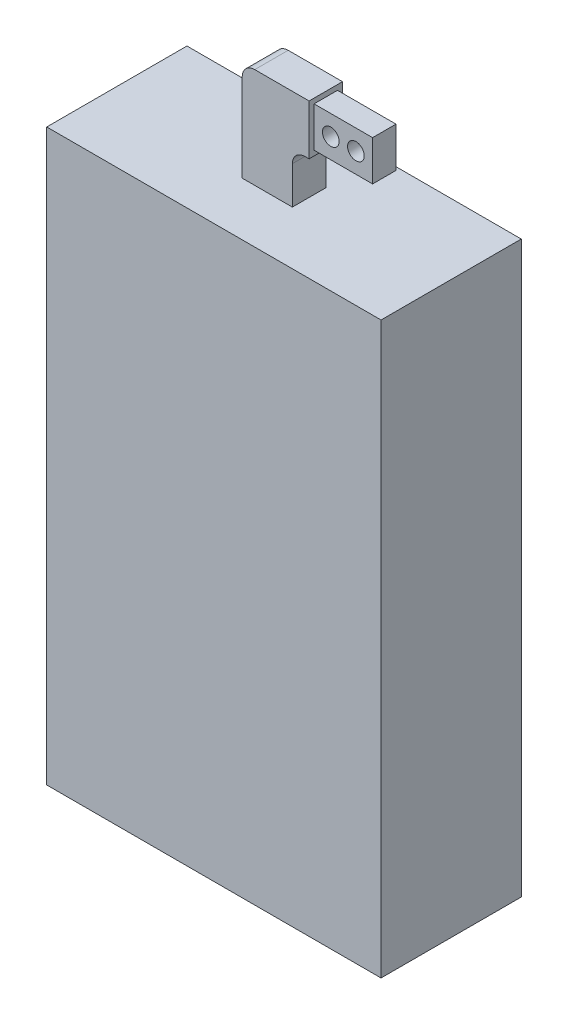
ISO-10303-21;
HEADER;
FILE_DESCRIPTION(('STEP AP214'),'2;1');
FILE_NAME('part.step','',(''),(''),'','','');
FILE_SCHEMA(('AUTOMOTIVE_DESIGN { 1 0 10303 214 1 1 1 1 }'));
ENDSEC;
DATA;
#1=APPLICATION_CONTEXT('core data for automotive mechanical design processes');
#2=APPLICATION_PROTOCOL_DEFINITION('international standard','automotive_design',2000,#1);
#3=PRODUCT_CONTEXT('',#1,'mechanical');
#4=PRODUCT('Part','Part','',(#3));
#5=PRODUCT_RELATED_PRODUCT_CATEGORY('part','',(#4));
#6=PRODUCT_DEFINITION_FORMATION('','',#4);
#7=PRODUCT_DEFINITION_CONTEXT('part definition',#1,'design');
#8=PRODUCT_DEFINITION('design','',#6,#7);
#9=PRODUCT_DEFINITION_SHAPE('','',#8);
#10=(LENGTH_UNIT() NAMED_UNIT(*) SI_UNIT(.MILLI.,.METRE.));
#11=(NAMED_UNIT(*) PLANE_ANGLE_UNIT() SI_UNIT($,.RADIAN.));
#12=(NAMED_UNIT(*) SI_UNIT($,.STERADIAN.) SOLID_ANGLE_UNIT());
#13=UNCERTAINTY_MEASURE_WITH_UNIT(LENGTH_MEASURE(1.E-05),#10,'distance_accuracy_value','');
#14=(GEOMETRIC_REPRESENTATION_CONTEXT(3) GLOBAL_UNCERTAINTY_ASSIGNED_CONTEXT((#13)) GLOBAL_UNIT_ASSIGNED_CONTEXT((#10,
#11,#12)) REPRESENTATION_CONTEXT('',''));
#15=CARTESIAN_POINT('',(0.,0.,0.));
#16=DIRECTION('',(0.,0.,1.));
#17=DIRECTION('',(1.,0.,0.));
#18=AXIS2_PLACEMENT_3D('',#15,#16,#17);
#19=CARTESIAN_POINT('',(-15.,60.,-10.));
#20=DIRECTION('',(0.,1.,0.));
#21=DIRECTION('',(0.,0.,1.));
#22=AXIS2_PLACEMENT_3D('',#19,#20,#21);
#23=PLANE('',#22);
#24=DIRECTION('',(-1.,0.,0.));
#25=VECTOR('',#24,1.);
#26=CARTESIAN_POINT('',(15.,60.,-10.));
#27=LINE('',#26,#25);
#28=CARTESIAN_POINT('',(25.,59.9999999999999,-10.));
#29=VERTEX_POINT('',#28);
#30=CARTESIAN_POINT('',(-7.5,60.,-10.));
#31=VERTEX_POINT('',#30);
#32=EDGE_CURVE('E227',#29,#31,#27,.T.);
#33=ORIENTED_EDGE('',*,*,#32,.T.);
#34=DIRECTION('',(0.,0.,1.));
#35=VECTOR('',#34,1.);
#36=CARTESIAN_POINT('',(-7.5,60.,-10.));
#37=LINE('',#36,#35);
#38=CARTESIAN_POINT('',(-7.5,60.,10.));
#39=VERTEX_POINT('',#38);
#40=EDGE_CURVE('E263',#31,#39,#37,.T.);
#41=ORIENTED_EDGE('',*,*,#40,.T.);
#42=DIRECTION('',(-1.,0.,0.));
#43=VECTOR('',#42,1.);
#44=CARTESIAN_POINT('',(15.,60.,10.));
#45=LINE('',#44,#43);
#46=CARTESIAN_POINT('',(25.,60.,10.));
#47=VERTEX_POINT('',#46);
#48=EDGE_CURVE('E215',#47,#39,#45,.T.);
#49=ORIENTED_EDGE('',*,*,#48,.F.);
#50=DIRECTION('',(0.,0.,1.));
#51=VECTOR('',#50,1.);
#52=CARTESIAN_POINT('',(25.,59.9999999999999,10.));
#53=LINE('',#52,#51);
#54=EDGE_CURVE('E204',#29,#47,#53,.T.);
#55=ORIENTED_EDGE('',*,*,#54,.F.);
#56=EDGE_LOOP('',(#33,#41,#49,#55));
#57=FACE_BOUND('',#56,.T.);
#58=ADVANCED_FACE('F36',(#57),#23,.T.);
#59=CARTESIAN_POINT('',(15.,30.,-10.));
#60=DIRECTION('',(0.,-1.,0.));
#61=DIRECTION('',(0.,0.,-1.));
#62=AXIS2_PLACEMENT_3D('',#59,#60,#61);
#63=PLANE('',#62);
#64=DIRECTION('',(1.,0.,0.));
#65=VECTOR('',#64,1.);
#66=CARTESIAN_POINT('',(15.,30.,10.));
#67=LINE('',#66,#65);
#68=CARTESIAN_POINT('',(22.5,30.,10.));
#69=VERTEX_POINT('',#68);
#70=CARTESIAN_POINT('',(25.,29.9999999999999,10.));
#71=VERTEX_POINT('',#70);
#72=EDGE_CURVE('E213',#69,#71,#67,.T.);
#73=ORIENTED_EDGE('',*,*,#72,.F.);
#74=DIRECTION('',(0.,0.,1.));
#75=VECTOR('',#74,1.);
#76=CARTESIAN_POINT('',(22.5,30.,-10.));
#77=LINE('',#76,#75);
#78=CARTESIAN_POINT('',(22.5,30.,-10.));
#79=VERTEX_POINT('',#78);
#80=EDGE_CURVE('E57',#69,#79,#77,.F.);
#81=ORIENTED_EDGE('',*,*,#80,.T.);
#82=DIRECTION('',(1.,0.,0.));
#83=VECTOR('',#82,1.);
#84=CARTESIAN_POINT('',(15.,30.,-10.));
#85=LINE('',#84,#83);
#86=CARTESIAN_POINT('',(25.,29.9999999999999,-10.));
#87=VERTEX_POINT('',#86);
#88=EDGE_CURVE('E225',#79,#87,#85,.T.);
#89=ORIENTED_EDGE('',*,*,#88,.T.);
#90=DIRECTION('',(0.,0.,-1.));
#91=VECTOR('',#90,1.);
#92=CARTESIAN_POINT('',(25.,29.9999999999999,10.));
#93=LINE('',#92,#91);
#94=EDGE_CURVE('E199',#71,#87,#93,.T.);
#95=ORIENTED_EDGE('',*,*,#94,.F.);
#96=EDGE_LOOP('',(#73,#81,#89,#95));
#97=FACE_BOUND('',#96,.T.);
#98=ADVANCED_FACE('F293',(#97),#63,.T.);
#99=CARTESIAN_POINT('',(0.,0.,-10.));
#100=DIRECTION('',(0.,0.,-1.));
#101=DIRECTION('',(-1.,0.,0.));
#102=AXIS2_PLACEMENT_3D('',#99,#100,#101);
#103=PLANE('',#102);
#104=DIRECTION('',(0.,-1.,0.));
#105=VECTOR('',#104,1.);
#106=CARTESIAN_POINT('',(-15.,0.,-10.));
#107=LINE('',#106,#105);
#108=CARTESIAN_POINT('',(-15.,52.5,-10.));
#109=VERTEX_POINT('',#108);
#110=CARTESIAN_POINT('',(-15.,0.,-10.));
#111=VERTEX_POINT('',#110);
#112=EDGE_CURVE('E218',#109,#111,#107,.T.);
#113=ORIENTED_EDGE('',*,*,#112,.F.);
#114=CARTESIAN_POINT('',(-7.5,52.5,-10.));
#115=DIRECTION('',(0.,0.,-1.));
#116=DIRECTION('',(-1.,0.,0.));
#117=AXIS2_PLACEMENT_3D('',#114,#115,#116);
#118=CIRCLE('',#117,7.5);
#119=EDGE_CURVE('E281',#109,#31,#118,.T.);
#120=ORIENTED_EDGE('',*,*,#119,.T.);
#121=ORIENTED_EDGE('',*,*,#32,.F.);
#122=DIRECTION('',(0.,1.,0.));
#123=VECTOR('',#122,1.);
#124=CARTESIAN_POINT('',(25.,59.9999999999999,-10.));
#125=LINE('',#124,#123);
#126=EDGE_CURVE('E202',#87,#29,#125,.T.);
#127=ORIENTED_EDGE('',*,*,#126,.F.);
#128=ORIENTED_EDGE('',*,*,#88,.F.);
#129=CARTESIAN_POINT('',(22.5,22.5,-10.));
#130=DIRECTION('',(0.,0.,-1.));
#131=DIRECTION('',(-1.,0.,0.));
#132=AXIS2_PLACEMENT_3D('',#129,#130,#131);
#133=CIRCLE('',#132,7.5);
#134=CARTESIAN_POINT('',(15.,22.5,-10.));
#135=VERTEX_POINT('',#134);
#136=EDGE_CURVE('E11',#79,#135,#133,.F.);
#137=ORIENTED_EDGE('',*,*,#136,.T.);
#138=DIRECTION('',(0.,1.,0.));
#139=VECTOR('',#138,1.);
#140=CARTESIAN_POINT('',(15.,0.,-10.));
#141=LINE('',#140,#139);
#142=CARTESIAN_POINT('',(15.,0.,-10.));
#143=VERTEX_POINT('',#142);
#144=EDGE_CURVE('E223',#143,#135,#141,.T.);
#145=ORIENTED_EDGE('',*,*,#144,.F.);
#146=DIRECTION('',(1.,0.,0.));
#147=VECTOR('',#146,1.);
#148=CARTESIAN_POINT('',(-15.,0.,-10.));
#149=LINE('',#148,#147);
#150=EDGE_CURVE('E220',#111,#143,#149,.T.);
#151=ORIENTED_EDGE('',*,*,#150,.F.);
#152=EDGE_LOOP('',(#113,#120,#121,#127,#128,#137,#145,#151));
#153=FACE_BOUND('',#152,.T.);
#154=ADVANCED_FACE('F299',(#153),#103,.T.);
#155=CARTESIAN_POINT('',(0.,0.,10.));
#156=DIRECTION('',(0.,0.,-1.));
#157=DIRECTION('',(-1.,0.,0.));
#158=AXIS2_PLACEMENT_3D('',#155,#156,#157);
#159=PLANE('',#158);
#160=ORIENTED_EDGE('',*,*,#48,.T.);
#161=CARTESIAN_POINT('',(-7.5,52.5,10.));
#162=DIRECTION('',(0.,0.,-1.));
#163=DIRECTION('',(-1.,0.,0.));
#164=AXIS2_PLACEMENT_3D('',#161,#162,#163);
#165=CIRCLE('',#164,7.5);
#166=CARTESIAN_POINT('',(-15.,52.5,10.));
#167=VERTEX_POINT('',#166);
#168=EDGE_CURVE('E277',#39,#167,#165,.F.);
#169=ORIENTED_EDGE('',*,*,#168,.T.);
#170=DIRECTION('',(0.,-1.,0.));
#171=VECTOR('',#170,1.);
#172=CARTESIAN_POINT('',(-15.,0.,10.));
#173=LINE('',#172,#171);
#174=CARTESIAN_POINT('',(-15.,0.,10.));
#175=VERTEX_POINT('',#174);
#176=EDGE_CURVE('E206',#167,#175,#173,.T.);
#177=ORIENTED_EDGE('',*,*,#176,.T.);
#178=DIRECTION('',(1.,0.,0.));
#179=VECTOR('',#178,1.);
#180=CARTESIAN_POINT('',(-15.,0.,10.));
#181=LINE('',#180,#179);
#182=CARTESIAN_POINT('',(15.,0.,10.));
#183=VERTEX_POINT('',#182);
#184=EDGE_CURVE('E208',#175,#183,#181,.T.);
#185=ORIENTED_EDGE('',*,*,#184,.T.);
#186=DIRECTION('',(0.,1.,0.));
#187=VECTOR('',#186,1.);
#188=CARTESIAN_POINT('',(15.,0.,10.));
#189=LINE('',#188,#187);
#190=CARTESIAN_POINT('',(15.,22.5,10.));
#191=VERTEX_POINT('',#190);
#192=EDGE_CURVE('E210',#183,#191,#189,.T.);
#193=ORIENTED_EDGE('',*,*,#192,.T.);
#194=CARTESIAN_POINT('',(22.5,22.5,10.));
#195=DIRECTION('',(0.,0.,-1.));
#196=DIRECTION('',(-1.,0.,0.));
#197=AXIS2_PLACEMENT_3D('',#194,#195,#196);
#198=CIRCLE('',#197,7.5);
#199=EDGE_CURVE('E44',#191,#69,#198,.T.);
#200=ORIENTED_EDGE('',*,*,#199,.T.);
#201=ORIENTED_EDGE('',*,*,#72,.T.);
#202=DIRECTION('',(0.,-1.,0.));
#203=VECTOR('',#202,1.);
#204=CARTESIAN_POINT('',(25.,59.9999999999999,10.));
#205=LINE('',#204,#203);
#206=EDGE_CURVE('E193',#47,#71,#205,.T.);
#207=ORIENTED_EDGE('',*,*,#206,.F.);
#208=EDGE_LOOP('',(#160,#169,#177,#185,#193,#200,#201,#207));
#209=FACE_BOUND('',#208,.T.);
#210=ADVANCED_FACE('F287',(#209),#159,.F.);
#211=CARTESIAN_POINT('',(0.,0.,0.));
#212=DIRECTION('',(0.,1.,0.));
#213=DIRECTION('',(0.,0.,1.));
#214=AXIS2_PLACEMENT_3D('',#211,#212,#213);
#215=PLANE('',#214);
#216=DIRECTION('',(0.,0.,1.));
#217=VECTOR('',#216,1.);
#218=CARTESIAN_POINT('',(-100.,0.,41.945));
#219=LINE('',#218,#217);
#220=CARTESIAN_POINT('',(-100.,0.,-41.945));
#221=VERTEX_POINT('',#220);
#222=CARTESIAN_POINT('',(-100.,0.,41.945));
#223=VERTEX_POINT('',#222);
#224=EDGE_CURVE('E234',#221,#223,#219,.T.);
#225=ORIENTED_EDGE('',*,*,#224,.T.);
#226=DIRECTION('',(1.,0.,0.));
#227=VECTOR('',#226,1.);
#228=CARTESIAN_POINT('',(100.,0.,41.945));
#229=LINE('',#228,#227);
#230=CARTESIAN_POINT('',(100.,0.,41.945));
#231=VERTEX_POINT('',#230);
#232=EDGE_CURVE('E253',#223,#231,#229,.T.);
#233=ORIENTED_EDGE('',*,*,#232,.T.);
#234=DIRECTION('',(0.,0.,-1.));
#235=VECTOR('',#234,1.);
#236=CARTESIAN_POINT('',(100.,0.,41.945));
#237=LINE('',#236,#235);
#238=CARTESIAN_POINT('',(100.,0.,-41.945));
#239=VERTEX_POINT('',#238);
#240=EDGE_CURVE('E256',#231,#239,#237,.T.);
#241=ORIENTED_EDGE('',*,*,#240,.T.);
#242=DIRECTION('',(-1.,0.,0.));
#243=VECTOR('',#242,1.);
#244=CARTESIAN_POINT('',(100.,0.,-41.945));
#245=LINE('',#244,#243);
#246=EDGE_CURVE('E241',#239,#221,#245,.T.);
#247=ORIENTED_EDGE('',*,*,#246,.T.);
#248=EDGE_LOOP('',(#225,#233,#241,#247));
#249=FACE_BOUND('',#248,.T.);
#250=ORIENTED_EDGE('',*,*,#150,.T.);
#251=DIRECTION('',(0.,0.,1.));
#252=VECTOR('',#251,1.);
#253=CARTESIAN_POINT('',(15.,0.,-10.));
#254=LINE('',#253,#252);
#255=EDGE_CURVE('E231',#143,#183,#254,.T.);
#256=ORIENTED_EDGE('',*,*,#255,.T.);
#257=ORIENTED_EDGE('',*,*,#184,.F.);
#258=DIRECTION('',(0.,0.,1.));
#259=VECTOR('',#258,1.);
#260=CARTESIAN_POINT('',(-15.,0.,-10.));
#261=LINE('',#260,#259);
#262=EDGE_CURVE('E230',#111,#175,#261,.T.);
#263=ORIENTED_EDGE('',*,*,#262,.F.);
#264=EDGE_LOOP('',(#250,#256,#257,#263));
#265=FACE_BOUND('',#264,.T.);
#266=ADVANCED_FACE('F304',(#249,#265),#215,.T.);
#267=CARTESIAN_POINT('',(-100.,-340.92,41.945));
#268=DIRECTION('',(-1.,0.,0.));
#269=DIRECTION('',(0.,0.,1.));
#270=AXIS2_PLACEMENT_3D('',#267,#268,#269);
#271=PLANE('',#270);
#272=ORIENTED_EDGE('',*,*,#224,.F.);
#273=DIRECTION('',(0.,1.,0.));
#274=VECTOR('',#273,1.);
#275=CARTESIAN_POINT('',(-100.,-340.92,-41.945));
#276=LINE('',#275,#274);
#277=CARTESIAN_POINT('',(-100.,-340.92,-41.945));
#278=VERTEX_POINT('',#277);
#279=EDGE_CURVE('E261',#278,#221,#276,.T.);
#280=ORIENTED_EDGE('',*,*,#279,.F.);
#281=DIRECTION('',(0.,0.,1.));
#282=VECTOR('',#281,1.);
#283=CARTESIAN_POINT('',(-100.,-340.92,41.945));
#284=LINE('',#283,#282);
#285=CARTESIAN_POINT('',(-100.,-340.92,41.945));
#286=VERTEX_POINT('',#285);
#287=EDGE_CURVE('E237',#278,#286,#284,.T.);
#288=ORIENTED_EDGE('',*,*,#287,.T.);
#289=DIRECTION('',(0.,1.,0.));
#290=VECTOR('',#289,1.);
#291=CARTESIAN_POINT('',(-100.,-340.92,41.945));
#292=LINE('',#291,#290);
#293=EDGE_CURVE('E250',#286,#223,#292,.T.);
#294=ORIENTED_EDGE('',*,*,#293,.T.);
#295=EDGE_LOOP('',(#272,#280,#288,#294));
#296=FACE_BOUND('',#295,.T.);
#297=ADVANCED_FACE('F350',(#296),#271,.T.);
#298=CARTESIAN_POINT('',(100.,-340.92,-41.945));
#299=DIRECTION('',(0.,0.,-1.));
#300=DIRECTION('',(-1.,0.,0.));
#301=AXIS2_PLACEMENT_3D('',#298,#299,#300);
#302=PLANE('',#301);
#303=ORIENTED_EDGE('',*,*,#246,.F.);
#304=DIRECTION('',(0.,1.,0.));
#305=VECTOR('',#304,1.);
#306=CARTESIAN_POINT('',(100.,-340.92,-41.945));
#307=LINE('',#306,#305);
#308=CARTESIAN_POINT('',(100.,-340.92,-41.945));
#309=VERTEX_POINT('',#308);
#310=EDGE_CURVE('E264',#309,#239,#307,.T.);
#311=ORIENTED_EDGE('',*,*,#310,.F.);
#312=DIRECTION('',(-1.,0.,0.));
#313=VECTOR('',#312,1.);
#314=CARTESIAN_POINT('',(100.,-340.92,-41.945));
#315=LINE('',#314,#313);
#316=EDGE_CURVE('E247',#309,#278,#315,.T.);
#317=ORIENTED_EDGE('',*,*,#316,.T.);
#318=ORIENTED_EDGE('',*,*,#279,.T.);
#319=EDGE_LOOP('',(#303,#311,#317,#318));
#320=FACE_BOUND('',#319,.T.);
#321=ADVANCED_FACE('F352',(#320),#302,.T.);
#322=CARTESIAN_POINT('',(100.,-340.92,41.945));
#323=DIRECTION('',(1.,0.,0.));
#324=DIRECTION('',(0.,0.,-1.));
#325=AXIS2_PLACEMENT_3D('',#322,#323,#324);
#326=PLANE('',#325);
#327=ORIENTED_EDGE('',*,*,#240,.F.);
#328=DIRECTION('',(0.,1.,0.));
#329=VECTOR('',#328,1.);
#330=CARTESIAN_POINT('',(100.,-340.92,41.945));
#331=LINE('',#330,#329);
#332=CARTESIAN_POINT('',(100.,-340.92,41.945));
#333=VERTEX_POINT('',#332);
#334=EDGE_CURVE('E266',#333,#231,#331,.T.);
#335=ORIENTED_EDGE('',*,*,#334,.F.);
#336=DIRECTION('',(0.,0.,-1.));
#337=VECTOR('',#336,1.);
#338=CARTESIAN_POINT('',(100.,-340.92,41.945));
#339=LINE('',#338,#337);
#340=EDGE_CURVE('E244',#333,#309,#339,.T.);
#341=ORIENTED_EDGE('',*,*,#340,.T.);
#342=ORIENTED_EDGE('',*,*,#310,.T.);
#343=EDGE_LOOP('',(#327,#335,#341,#342));
#344=FACE_BOUND('',#343,.T.);
#345=ADVANCED_FACE('F355',(#344),#326,.T.);
#346=CARTESIAN_POINT('',(100.,-340.92,41.945));
#347=DIRECTION('',(0.,0.,1.));
#348=DIRECTION('',(1.,0.,0.));
#349=AXIS2_PLACEMENT_3D('',#346,#347,#348);
#350=PLANE('',#349);
#351=ORIENTED_EDGE('',*,*,#232,.F.);
#352=ORIENTED_EDGE('',*,*,#293,.F.);
#353=DIRECTION('',(1.,0.,0.));
#354=VECTOR('',#353,1.);
#355=CARTESIAN_POINT('',(100.,-340.92,41.945));
#356=LINE('',#355,#354);
#357=EDGE_CURVE('E240',#286,#333,#356,.T.);
#358=ORIENTED_EDGE('',*,*,#357,.T.);
#359=ORIENTED_EDGE('',*,*,#334,.T.);
#360=EDGE_LOOP('',(#351,#352,#358,#359));
#361=FACE_BOUND('',#360,.T.);
#362=ADVANCED_FACE('F346',(#361),#350,.T.);
#363=CARTESIAN_POINT('',(0.,-340.92,0.));
#364=DIRECTION('',(0.,1.,0.));
#365=DIRECTION('',(0.,0.,1.));
#366=AXIS2_PLACEMENT_3D('',#363,#364,#365);
#367=PLANE('',#366);
#368=ORIENTED_EDGE('',*,*,#287,.F.);
#369=ORIENTED_EDGE('',*,*,#316,.F.);
#370=ORIENTED_EDGE('',*,*,#340,.F.);
#371=ORIENTED_EDGE('',*,*,#357,.F.);
#372=EDGE_LOOP('',(#368,#369,#370,#371));
#373=FACE_BOUND('',#372,.T.);
#374=ADVANCED_FACE('F343',(#373),#367,.F.);
#375=CARTESIAN_POINT('',(-15.,0.,-10.));
#376=DIRECTION('',(-1.,0.,0.));
#377=DIRECTION('',(0.,0.,1.));
#378=AXIS2_PLACEMENT_3D('',#375,#376,#377);
#379=PLANE('',#378);
#380=ORIENTED_EDGE('',*,*,#176,.F.);
#381=DIRECTION('',(0.,0.,1.));
#382=VECTOR('',#381,1.);
#383=CARTESIAN_POINT('',(-15.,52.5,-10.));
#384=LINE('',#383,#382);
#385=EDGE_CURVE('E279',#167,#109,#384,.F.);
#386=ORIENTED_EDGE('',*,*,#385,.T.);
#387=ORIENTED_EDGE('',*,*,#112,.T.);
#388=ORIENTED_EDGE('',*,*,#262,.T.);
#389=EDGE_LOOP('',(#380,#386,#387,#388));
#390=FACE_BOUND('',#389,.T.);
#391=ADVANCED_FACE('F307',(#390),#379,.T.);
#392=CARTESIAN_POINT('',(15.,0.,-10.));
#393=DIRECTION('',(1.,0.,0.));
#394=DIRECTION('',(0.,1.,0.));
#395=AXIS2_PLACEMENT_3D('',#392,#393,#394);
#396=PLANE('',#395);
#397=ORIENTED_EDGE('',*,*,#144,.T.);
#398=DIRECTION('',(0.,0.,1.));
#399=VECTOR('',#398,1.);
#400=CARTESIAN_POINT('',(15.,22.5,10.));
#401=LINE('',#400,#399);
#402=EDGE_CURVE('E283',#135,#191,#401,.T.);
#403=ORIENTED_EDGE('',*,*,#402,.T.);
#404=ORIENTED_EDGE('',*,*,#192,.F.);
#405=ORIENTED_EDGE('',*,*,#255,.F.);
#406=EDGE_LOOP('',(#397,#403,#404,#405));
#407=FACE_BOUND('',#406,.T.);
#408=ADVANCED_FACE('F295',(#407),#396,.T.);
#409=CARTESIAN_POINT('',(25.,0.,0.));
#410=DIRECTION('',(1.,0.,0.));
#411=DIRECTION('',(0.,1.,0.));
#412=AXIS2_PLACEMENT_3D('',#409,#410,#411);
#413=PLANE('',#412);
#414=DIRECTION('',(0.,0.,1.));
#415=VECTOR('',#414,1.);
#416=CARTESIAN_POINT('',(25.,56.9999999999999,-7.));
#417=LINE('',#416,#415);
#418=CARTESIAN_POINT('',(25.,56.9999999999999,-7.));
#419=VERTEX_POINT('',#418);
#420=CARTESIAN_POINT('',(25.,56.9999999999999,7.));
#421=VERTEX_POINT('',#420);
#422=EDGE_CURVE('E160',#419,#421,#417,.T.);
#423=ORIENTED_EDGE('',*,*,#422,.F.);
#424=DIRECTION('',(0.,1.,0.));
#425=VECTOR('',#424,1.);
#426=CARTESIAN_POINT('',(25.,32.9999999999999,-7.));
#427=LINE('',#426,#425);
#428=CARTESIAN_POINT('',(25.,32.9999999999999,-7.));
#429=VERTEX_POINT('',#428);
#430=EDGE_CURVE('E170',#429,#419,#427,.T.);
#431=ORIENTED_EDGE('',*,*,#430,.F.);
#432=DIRECTION('',(0.,0.,-1.));
#433=VECTOR('',#432,1.);
#434=CARTESIAN_POINT('',(25.,32.9999999999999,-7.));
#435=LINE('',#434,#433);
#436=CARTESIAN_POINT('',(25.,32.9999999999999,7.));
#437=VERTEX_POINT('',#436);
#438=EDGE_CURVE('E152',#437,#429,#435,.T.);
#439=ORIENTED_EDGE('',*,*,#438,.F.);
#440=DIRECTION('',(0.,-1.,0.));
#441=VECTOR('',#440,1.);
#442=CARTESIAN_POINT('',(25.,32.9999999999999,7.));
#443=LINE('',#442,#441);
#444=EDGE_CURVE('E167',#421,#437,#443,.T.);
#445=ORIENTED_EDGE('',*,*,#444,.F.);
#446=EDGE_LOOP('',(#423,#431,#439,#445));
#447=FACE_BOUND('',#446,.T.);
#448=ORIENTED_EDGE('',*,*,#206,.T.);
#449=ORIENTED_EDGE('',*,*,#94,.T.);
#450=ORIENTED_EDGE('',*,*,#126,.T.);
#451=ORIENTED_EDGE('',*,*,#54,.T.);
#452=EDGE_LOOP('',(#448,#449,#450,#451));
#453=FACE_BOUND('',#452,.T.);
#454=ADVANCED_FACE('F165',(#447,#453),#413,.T.);
#455=CARTESIAN_POINT('',(25.,32.9999999999999,7.));
#456=DIRECTION('',(0.,0.,1.));
#457=DIRECTION('',(1.,0.,0.));
#458=AXIS2_PLACEMENT_3D('',#455,#456,#457);
#459=PLANE('',#458);
#460=CARTESIAN_POINT('',(35.,44.9999999999999,7.));
#461=DIRECTION('',(0.,0.,1.));
#462=DIRECTION('',(1.,0.,0.));
#463=AXIS2_PLACEMENT_3D('',#460,#461,#462);
#464=CIRCLE('',#463,5.);
#465=CARTESIAN_POINT('',(40.,44.9999999999999,7.));
#466=VERTEX_POINT('',#465);
#467=EDGE_CURVE('E272',#466,#466,#464,.T.);
#468=ORIENTED_EDGE('',*,*,#467,.F.);
#469=EDGE_LOOP('',(#468));
#470=FACE_BOUND('',#469,.T.);
#471=CARTESIAN_POINT('',(50.,44.9999999999999,7.));
#472=DIRECTION('',(0.,0.,1.));
#473=DIRECTION('',(1.,0.,0.));
#474=AXIS2_PLACEMENT_3D('',#471,#472,#473);
#475=CIRCLE('',#474,5.00000000000001);
#476=CARTESIAN_POINT('',(55.,44.9999999999999,7.));
#477=VERTEX_POINT('',#476);
#478=EDGE_CURVE('E181',#477,#477,#475,.T.);
#479=ORIENTED_EDGE('',*,*,#478,.F.);
#480=EDGE_LOOP('',(#479));
#481=FACE_BOUND('',#480,.T.);
#482=DIRECTION('',(0.,-1.,0.));
#483=VECTOR('',#482,1.);
#484=CARTESIAN_POINT('',(60.,32.9999999999999,7.));
#485=LINE('',#484,#483);
#486=CARTESIAN_POINT('',(60.,56.9999999999999,7.));
#487=VERTEX_POINT('',#486);
#488=CARTESIAN_POINT('',(60.,32.9999999999999,7.));
#489=VERTEX_POINT('',#488);
#490=EDGE_CURVE('E186',#487,#489,#485,.T.);
#491=ORIENTED_EDGE('',*,*,#490,.F.);
#492=DIRECTION('',(1.,0.,0.));
#493=VECTOR('',#492,1.);
#494=CARTESIAN_POINT('',(25.,56.9999999999999,7.));
#495=LINE('',#494,#493);
#496=EDGE_CURVE('E174',#421,#487,#495,.T.);
#497=ORIENTED_EDGE('',*,*,#496,.F.);
#498=ORIENTED_EDGE('',*,*,#444,.T.);
#499=DIRECTION('',(1.,0.,0.));
#500=VECTOR('',#499,1.);
#501=CARTESIAN_POINT('',(25.,32.9999999999999,7.));
#502=LINE('',#501,#500);
#503=EDGE_CURVE('E148',#437,#489,#502,.T.);
#504=ORIENTED_EDGE('',*,*,#503,.T.);
#505=EDGE_LOOP('',(#491,#497,#498,#504));
#506=FACE_BOUND('',#505,.T.);
#507=ADVANCED_FACE('F173',(#470,#481,#506),#459,.T.);
#508=CARTESIAN_POINT('',(25.,56.9999999999999,-7.));
#509=DIRECTION('',(0.,1.,0.));
#510=DIRECTION('',(-1.,0.,0.));
#511=AXIS2_PLACEMENT_3D('',#508,#509,#510);
#512=PLANE('',#511);
#513=DIRECTION('',(0.,0.,1.));
#514=VECTOR('',#513,1.);
#515=CARTESIAN_POINT('',(60.,56.9999999999999,-7.));
#516=LINE('',#515,#514);
#517=CARTESIAN_POINT('',(60.,56.9999999999999,-7.));
#518=VERTEX_POINT('',#517);
#519=EDGE_CURVE('E175',#518,#487,#516,.T.);
#520=ORIENTED_EDGE('',*,*,#519,.F.);
#521=DIRECTION('',(1.,0.,0.));
#522=VECTOR('',#521,1.);
#523=CARTESIAN_POINT('',(25.,56.9999999999999,-7.));
#524=LINE('',#523,#522);
#525=EDGE_CURVE('E194',#419,#518,#524,.T.);
#526=ORIENTED_EDGE('',*,*,#525,.F.);
#527=ORIENTED_EDGE('',*,*,#422,.T.);
#528=ORIENTED_EDGE('',*,*,#496,.T.);
#529=EDGE_LOOP('',(#520,#526,#527,#528));
#530=FACE_BOUND('',#529,.T.);
#531=ADVANCED_FACE('F323',(#530),#512,.T.);
#532=CARTESIAN_POINT('',(25.,32.9999999999999,-7.));
#533=DIRECTION('',(0.,0.,-1.));
#534=DIRECTION('',(-1.,0.,0.));
#535=AXIS2_PLACEMENT_3D('',#532,#533,#534);
#536=PLANE('',#535);
#537=CARTESIAN_POINT('',(35.,44.9999999999999,-7.));
#538=DIRECTION('',(0.,0.,-1.));
#539=DIRECTION('',(-1.,0.,0.));
#540=AXIS2_PLACEMENT_3D('',#537,#538,#539);
#541=CIRCLE('',#540,5.);
#542=CARTESIAN_POINT('',(30.,44.9999999999999,-7.));
#543=VERTEX_POINT('',#542);
#544=EDGE_CURVE('E188',#543,#543,#541,.T.);
#545=ORIENTED_EDGE('',*,*,#544,.F.);
#546=EDGE_LOOP('',(#545));
#547=FACE_BOUND('',#546,.T.);
#548=CARTESIAN_POINT('',(50.,44.9999999999999,-7.));
#549=DIRECTION('',(0.,0.,-1.));
#550=DIRECTION('',(-1.,0.,0.));
#551=AXIS2_PLACEMENT_3D('',#548,#549,#550);
#552=CIRCLE('',#551,5.00000000000001);
#553=CARTESIAN_POINT('',(45.,44.9999999999999,-7.));
#554=VERTEX_POINT('',#553);
#555=EDGE_CURVE('E269',#554,#554,#552,.T.);
#556=ORIENTED_EDGE('',*,*,#555,.F.);
#557=EDGE_LOOP('',(#556));
#558=FACE_BOUND('',#557,.T.);
#559=DIRECTION('',(0.,1.,0.));
#560=VECTOR('',#559,1.);
#561=CARTESIAN_POINT('',(60.,32.9999999999999,-7.));
#562=LINE('',#561,#560);
#563=CARTESIAN_POINT('',(60.,32.9999999999999,-7.));
#564=VERTEX_POINT('',#563);
#565=EDGE_CURVE('E178',#564,#518,#562,.T.);
#566=ORIENTED_EDGE('',*,*,#565,.F.);
#567=DIRECTION('',(1.,0.,0.));
#568=VECTOR('',#567,1.);
#569=CARTESIAN_POINT('',(25.,32.9999999999999,-7.));
#570=LINE('',#569,#568);
#571=EDGE_CURVE('E159',#429,#564,#570,.T.);
#572=ORIENTED_EDGE('',*,*,#571,.F.);
#573=ORIENTED_EDGE('',*,*,#430,.T.);
#574=ORIENTED_EDGE('',*,*,#525,.T.);
#575=EDGE_LOOP('',(#566,#572,#573,#574));
#576=FACE_BOUND('',#575,.T.);
#577=ADVANCED_FACE('F382',(#547,#558,#576),#536,.T.);
#578=CARTESIAN_POINT('',(25.,32.9999999999999,-7.));
#579=DIRECTION('',(0.,-1.,0.));
#580=DIRECTION('',(1.,0.,0.));
#581=AXIS2_PLACEMENT_3D('',#578,#579,#580);
#582=PLANE('',#581);
#583=DIRECTION('',(0.,0.,-1.));
#584=VECTOR('',#583,1.);
#585=CARTESIAN_POINT('',(60.,32.9999999999999,-7.));
#586=LINE('',#585,#584);
#587=EDGE_CURVE('E154',#489,#564,#586,.T.);
#588=ORIENTED_EDGE('',*,*,#587,.F.);
#589=ORIENTED_EDGE('',*,*,#503,.F.);
#590=ORIENTED_EDGE('',*,*,#438,.T.);
#591=ORIENTED_EDGE('',*,*,#571,.T.);
#592=EDGE_LOOP('',(#588,#589,#590,#591));
#593=FACE_BOUND('',#592,.T.);
#594=ADVANCED_FACE('F150',(#593),#582,.T.);
#595=CARTESIAN_POINT('',(60.,60.,-10.));
#596=DIRECTION('',(1.,0.,0.));
#597=DIRECTION('',(0.,1.,0.));
#598=AXIS2_PLACEMENT_3D('',#595,#596,#597);
#599=PLANE('',#598);
#600=ORIENTED_EDGE('',*,*,#519,.T.);
#601=ORIENTED_EDGE('',*,*,#490,.T.);
#602=ORIENTED_EDGE('',*,*,#587,.T.);
#603=ORIENTED_EDGE('',*,*,#565,.T.);
#604=EDGE_LOOP('',(#600,#601,#602,#603));
#605=FACE_BOUND('',#604,.T.);
#606=ADVANCED_FACE('F336',(#605),#599,.T.);
#607=CARTESIAN_POINT('',(50.,44.9999999999999,-41.945));
#608=DIRECTION('',(0.,0.,1.));
#609=DIRECTION('',(1.,0.,0.));
#610=AXIS2_PLACEMENT_3D('',#607,#608,#609);
#611=CYLINDRICAL_SURFACE('',#610,5.00000000000001);
#612=ORIENTED_EDGE('',*,*,#555,.T.);
#613=EDGE_LOOP('',(#612));
#614=FACE_BOUND('',#613,.T.);
#615=ORIENTED_EDGE('',*,*,#478,.T.);
#616=EDGE_LOOP('',(#615));
#617=FACE_BOUND('',#616,.T.);
#618=ADVANCED_FACE('F338',(#614,#617),#611,.F.);
#619=CARTESIAN_POINT('',(35.,44.9999999999999,-41.945));
#620=DIRECTION('',(0.,0.,1.));
#621=DIRECTION('',(1.,0.,0.));
#622=AXIS2_PLACEMENT_3D('',#619,#620,#621);
#623=CYLINDRICAL_SURFACE('',#622,5.);
#624=ORIENTED_EDGE('',*,*,#544,.T.);
#625=EDGE_LOOP('',(#624));
#626=FACE_BOUND('',#625,.T.);
#627=ORIENTED_EDGE('',*,*,#467,.T.);
#628=EDGE_LOOP('',(#627));
#629=FACE_BOUND('',#628,.T.);
#630=ADVANCED_FACE('F366',(#626,#629),#623,.F.);
#631=CARTESIAN_POINT('',(-7.5,52.5,-10.));
#632=DIRECTION('',(0.,0.,1.));
#633=DIRECTION('',(1.,0.,0.));
#634=AXIS2_PLACEMENT_3D('',#631,#632,#633);
#635=CYLINDRICAL_SURFACE('',#634,7.5);
#636=ORIENTED_EDGE('',*,*,#119,.F.);
#637=ORIENTED_EDGE('',*,*,#385,.F.);
#638=ORIENTED_EDGE('',*,*,#168,.F.);
#639=ORIENTED_EDGE('',*,*,#40,.F.);
#640=EDGE_LOOP('',(#636,#637,#638,#639));
#641=FACE_BOUND('',#640,.T.);
#642=ADVANCED_FACE('F310',(#641),#635,.T.);
#643=CARTESIAN_POINT('',(22.5,22.5,-10.));
#644=DIRECTION('',(0.,0.,-1.));
#645=DIRECTION('',(-1.,0.,0.));
#646=AXIS2_PLACEMENT_3D('',#643,#644,#645);
#647=CYLINDRICAL_SURFACE('',#646,7.5);
#648=ORIENTED_EDGE('',*,*,#136,.F.);
#649=ORIENTED_EDGE('',*,*,#80,.F.);
#650=ORIENTED_EDGE('',*,*,#199,.F.);
#651=ORIENTED_EDGE('',*,*,#402,.F.);
#652=EDGE_LOOP('',(#648,#649,#650,#651));
#653=FACE_BOUND('',#652,.T.);
#654=ADVANCED_FACE('F38',(#653),#647,.F.);
#655=CLOSED_SHELL('',(#58,#98,#154,#210,#266,#297,#321,#345,#362,#374,#391,#408,#454,#507,#531,
#577,#594,#606,#618,#630,#642,#654));
#656=MANIFOLD_SOLID_BREP('B2',#655);
#657=ADVANCED_BREP_SHAPE_REPRESENTATION('',(#18,#656),#14);
#658=SHAPE_DEFINITION_REPRESENTATION(#9,#657);
ENDSEC;
END-ISO-10303-21;
